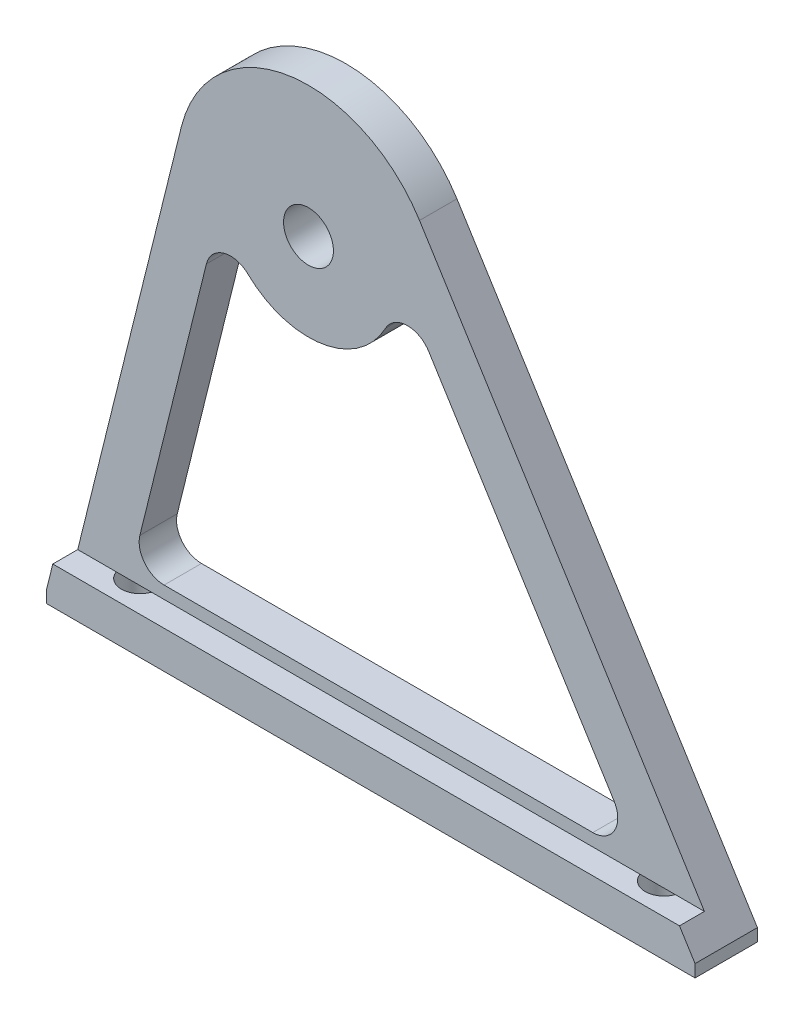
ISO-10303-21;
HEADER;
FILE_DESCRIPTION(('STEP AP214'),'2;1');
FILE_NAME('part.step','',(''),(''),'','','');
FILE_SCHEMA(('AUTOMOTIVE_DESIGN { 1 0 10303 214 1 1 1 1 }'));
ENDSEC;
DATA;
#1=APPLICATION_CONTEXT('core data for automotive mechanical design processes');
#2=APPLICATION_PROTOCOL_DEFINITION('international standard','automotive_design',2000,#1);
#3=PRODUCT_CONTEXT('',#1,'mechanical');
#4=PRODUCT('Part','Part','',(#3));
#5=PRODUCT_RELATED_PRODUCT_CATEGORY('part','',(#4));
#6=PRODUCT_DEFINITION_FORMATION('','',#4);
#7=PRODUCT_DEFINITION_CONTEXT('part definition',#1,'design');
#8=PRODUCT_DEFINITION('design','',#6,#7);
#9=PRODUCT_DEFINITION_SHAPE('','',#8);
#10=(LENGTH_UNIT() NAMED_UNIT(*) SI_UNIT(.MILLI.,.METRE.));
#11=(NAMED_UNIT(*) PLANE_ANGLE_UNIT() SI_UNIT($,.RADIAN.));
#12=(NAMED_UNIT(*) SI_UNIT($,.STERADIAN.) SOLID_ANGLE_UNIT());
#13=UNCERTAINTY_MEASURE_WITH_UNIT(LENGTH_MEASURE(1.E-05),#10,'distance_accuracy_value','');
#14=(GEOMETRIC_REPRESENTATION_CONTEXT(3) GLOBAL_UNCERTAINTY_ASSIGNED_CONTEXT((#13)) GLOBAL_UNIT_ASSIGNED_CONTEXT((#10,
#11,#12)) REPRESENTATION_CONTEXT('',''));
#15=CARTESIAN_POINT('',(0.,0.,0.));
#16=DIRECTION('',(0.,0.,1.));
#17=DIRECTION('',(1.,0.,0.));
#18=AXIS2_PLACEMENT_3D('',#15,#16,#17);
#19=CARTESIAN_POINT('',(0.,0.,5.));
#20=DIRECTION('',(0.,0.,-1.));
#21=DIRECTION('',(-1.,0.,0.));
#22=AXIS2_PLACEMENT_3D('',#19,#20,#21);
#23=CYLINDRICAL_SURFACE('',#22,10.5);
#24=CARTESIAN_POINT('',(0.,0.,3.));
#25=DIRECTION('',(0.,0.,1.));
#26=DIRECTION('',(1.,0.,0.));
#27=AXIS2_PLACEMENT_3D('',#24,#25,#26);
#28=CIRCLE('',#27,10.5);
#29=CARTESIAN_POINT('',(8.90471895944787,5.56380986853879,3.));
#30=VERTEX_POINT('',#29);
#31=CARTESIAN_POINT('',(-10.1914133471424,2.52687435138502,3.));
#32=VERTEX_POINT('',#31);
#33=EDGE_CURVE('E214',#30,#32,#28,.T.);
#34=ORIENTED_EDGE('',*,*,#33,.F.);
#35=DIRECTION('',(0.,0.,-1.));
#36=VECTOR('',#35,1.);
#37=CARTESIAN_POINT('',(8.90471895944788,5.56380986853878,5.));
#38=LINE('',#37,#36);
#39=CARTESIAN_POINT('',(8.90471895944788,5.56380986853878,0.));
#40=VERTEX_POINT('',#39);
#41=EDGE_CURVE('E277',#30,#40,#38,.T.);
#42=ORIENTED_EDGE('',*,*,#41,.T.);
#43=CARTESIAN_POINT('',(0.,0.,0.));
#44=DIRECTION('',(0.,0.,1.));
#45=DIRECTION('',(1.,0.,0.));
#46=AXIS2_PLACEMENT_3D('',#43,#44,#45);
#47=CIRCLE('',#46,10.5);
#48=CARTESIAN_POINT('',(-10.1914133471424,2.52687435138502,0.));
#49=VERTEX_POINT('',#48);
#50=EDGE_CURVE('E264',#40,#49,#47,.T.);
#51=ORIENTED_EDGE('',*,*,#50,.T.);
#52=DIRECTION('',(0.,0.,-1.));
#53=VECTOR('',#52,1.);
#54=CARTESIAN_POINT('',(-10.1914133471424,2.52687435138502,5.));
#55=LINE('',#54,#53);
#56=EDGE_CURVE('E41',#32,#49,#55,.T.);
#57=ORIENTED_EDGE('',*,*,#56,.F.);
#58=EDGE_LOOP('',(#34,#42,#51,#57));
#59=FACE_BOUND('',#58,.T.);
#60=ADVANCED_FACE('F34',(#59),#23,.T.);
#61=CARTESIAN_POINT('',(-8.45269707809848,-7.0818439433983,5.));
#62=DIRECTION('',(0.970610794965944,-0.240654700131907,0.));
#63=DIRECTION('',(0.240654700131907,0.970610794965944,0.));
#64=AXIS2_PLACEMENT_3D('',#61,#62,#63);
#65=PLANE('',#64);
#66=DIRECTION('',(0.,0.,-1.));
#67=VECTOR('',#66,1.);
#68=CARTESIAN_POINT('',(-8.18468792196786,-6.00090689979386,5.));
#69=LINE('',#68,#67);
#70=CARTESIAN_POINT('',(-8.18468792196786,-6.00090689979386,3.));
#71=VERTEX_POINT('',#70);
#72=CARTESIAN_POINT('',(-8.18468792196786,-6.00090689979386,0.));
#73=VERTEX_POINT('',#72);
#74=EDGE_CURVE('E248',#71,#73,#69,.T.);
#75=ORIENTED_EDGE('',*,*,#74,.F.);
#76=DIRECTION('',(-0.240654700131907,-0.970610794965944,0.));
#77=VECTOR('',#76,1.);
#78=CARTESIAN_POINT('',(-8.45269707809848,-7.0818439433983,3.));
#79=LINE('',#78,#77);
#80=CARTESIAN_POINT('',(-13.5198395714965,-27.5186905997362,3.));
#81=VERTEX_POINT('',#80);
#82=EDGE_CURVE('E209',#71,#81,#79,.T.);
#83=ORIENTED_EDGE('',*,*,#82,.T.);
#84=DIRECTION('',(0.,0.,-1.));
#85=VECTOR('',#84,1.);
#86=CARTESIAN_POINT('',(-13.5198395714965,-27.5186905997362,5.));
#87=LINE('',#86,#85);
#88=CARTESIAN_POINT('',(-13.5198395714965,-27.5186905997362,0.));
#89=VERTEX_POINT('',#88);
#90=EDGE_CURVE('E262',#81,#89,#87,.T.);
#91=ORIENTED_EDGE('',*,*,#90,.T.);
#92=DIRECTION('',(-0.240654700131907,-0.970610794965944,0.));
#93=VECTOR('',#92,1.);
#94=CARTESIAN_POINT('',(-8.45269707809848,-7.0818439433983,0.));
#95=LINE('',#94,#93);
#96=EDGE_CURVE('E224',#73,#89,#95,.T.);
#97=ORIENTED_EDGE('',*,*,#96,.F.);
#98=EDGE_LOOP('',(#75,#83,#91,#97));
#99=FACE_BOUND('',#98,.T.);
#100=ADVANCED_FACE('F346',(#99),#65,.T.);
#101=CARTESIAN_POINT('',(-11.5786179815646,-28.,5.));
#102=DIRECTION('',(0.,0.,-1.));
#103=DIRECTION('',(-1.,0.,0.));
#104=AXIS2_PLACEMENT_3D('',#101,#102,#103);
#105=CYLINDRICAL_SURFACE('',#104,2.);
#106=ORIENTED_EDGE('',*,*,#90,.F.);
#107=CARTESIAN_POINT('',(-11.5786179815646,-28.,3.));
#108=DIRECTION('',(0.,0.,1.));
#109=DIRECTION('',(1.,0.,0.));
#110=AXIS2_PLACEMENT_3D('',#107,#108,#109);
#111=CIRCLE('',#110,2.);
#112=CARTESIAN_POINT('',(-11.5786179815646,-30.,3.));
#113=VERTEX_POINT('',#112);
#114=EDGE_CURVE('E206',#81,#113,#111,.T.);
#115=ORIENTED_EDGE('',*,*,#114,.T.);
#116=DIRECTION('',(0.,0.,-1.));
#117=VECTOR('',#116,1.);
#118=CARTESIAN_POINT('',(-11.5786179815646,-30.,5.));
#119=LINE('',#118,#117);
#120=CARTESIAN_POINT('',(-11.5786179815646,-30.,0.));
#121=VERTEX_POINT('',#120);
#122=EDGE_CURVE('E260',#113,#121,#119,.T.);
#123=ORIENTED_EDGE('',*,*,#122,.T.);
#124=CARTESIAN_POINT('',(-11.5786179815646,-28.,0.));
#125=DIRECTION('',(0.,0.,1.));
#126=DIRECTION('',(-1.,0.,0.));
#127=AXIS2_PLACEMENT_3D('',#124,#125,#126);
#128=CIRCLE('',#127,2.);
#129=EDGE_CURVE('E227',#89,#121,#128,.T.);
#130=ORIENTED_EDGE('',*,*,#129,.F.);
#131=EDGE_LOOP('',(#106,#115,#123,#130));
#132=FACE_BOUND('',#131,.T.);
#133=ADVANCED_FACE('F344',(#132),#105,.F.);
#134=CARTESIAN_POINT('',(-11.5786179815646,-30.,5.));
#135=DIRECTION('',(0.,1.,0.));
#136=DIRECTION('',(0.,0.,1.));
#137=AXIS2_PLACEMENT_3D('',#134,#135,#136);
#138=PLANE('',#137);
#139=ORIENTED_EDGE('',*,*,#122,.F.);
#140=DIRECTION('',(1.,0.,0.));
#141=VECTOR('',#140,1.);
#142=CARTESIAN_POINT('',(-11.5786179815646,-30.,3.));
#143=LINE('',#142,#141);
#144=CARTESIAN_POINT('',(22.8010201381667,-30.,3.));
#145=VERTEX_POINT('',#144);
#146=EDGE_CURVE('E203',#113,#145,#143,.T.);
#147=ORIENTED_EDGE('',*,*,#146,.T.);
#148=DIRECTION('',(0.,0.,-1.));
#149=VECTOR('',#148,1.);
#150=CARTESIAN_POINT('',(22.8010201381667,-30.,5.));
#151=LINE('',#150,#149);
#152=CARTESIAN_POINT('',(22.8010201381667,-30.,0.));
#153=VERTEX_POINT('',#152);
#154=EDGE_CURVE('E258',#145,#153,#151,.T.);
#155=ORIENTED_EDGE('',*,*,#154,.T.);
#156=DIRECTION('',(1.,0.,0.));
#157=VECTOR('',#156,1.);
#158=CARTESIAN_POINT('',(-11.5786179815646,-30.,0.));
#159=LINE('',#158,#157);
#160=EDGE_CURVE('E230',#121,#153,#159,.T.);
#161=ORIENTED_EDGE('',*,*,#160,.F.);
#162=EDGE_LOOP('',(#139,#147,#155,#161));
#163=FACE_BOUND('',#162,.T.);
#164=ADVANCED_FACE('F339',(#163),#138,.T.);
#165=CARTESIAN_POINT('',(22.8010201381667,-28.,5.));
#166=DIRECTION('',(0.,0.,-1.));
#167=DIRECTION('',(-1.,0.,0.));
#168=AXIS2_PLACEMENT_3D('',#165,#166,#167);
#169=CYLINDRICAL_SURFACE('',#168,2.);
#170=ORIENTED_EDGE('',*,*,#154,.F.);
#171=CARTESIAN_POINT('',(22.8010201381667,-28.,3.));
#172=DIRECTION('',(0.,0.,1.));
#173=DIRECTION('',(1.,0.,0.));
#174=AXIS2_PLACEMENT_3D('',#171,#172,#173);
#175=CIRCLE('',#174,2.);
#176=CARTESIAN_POINT('',(24.4971570828234,-26.9402266917069,3.));
#177=VERTEX_POINT('',#176);
#178=EDGE_CURVE('E200',#145,#177,#175,.T.);
#179=ORIENTED_EDGE('',*,*,#178,.T.);
#180=DIRECTION('',(0.,0.,-1.));
#181=VECTOR('',#180,1.);
#182=CARTESIAN_POINT('',(24.4971570828234,-26.9402266917069,5.));
#183=LINE('',#182,#181);
#184=CARTESIAN_POINT('',(24.4971570828234,-26.9402266917069,0.));
#185=VERTEX_POINT('',#184);
#186=EDGE_CURVE('E256',#177,#185,#183,.T.);
#187=ORIENTED_EDGE('',*,*,#186,.T.);
#188=CARTESIAN_POINT('',(22.8010201381667,-28.,0.));
#189=DIRECTION('',(0.,0.,1.));
#190=DIRECTION('',(1.,0.,0.));
#191=AXIS2_PLACEMENT_3D('',#188,#189,#190);
#192=CIRCLE('',#191,2.);
#193=EDGE_CURVE('E233',#153,#185,#192,.T.);
#194=ORIENTED_EDGE('',*,*,#193,.F.);
#195=EDGE_LOOP('',(#170,#179,#187,#194));
#196=FACE_BOUND('',#195,.T.);
#197=ADVANCED_FACE('F336',(#196),#169,.F.);
#198=CARTESIAN_POINT('',(24.4971570828234,-26.9402266917069,5.));
#199=DIRECTION('',(-0.848068472328369,-0.529886654146551,0.));
#200=DIRECTION('',(0.529886654146551,-0.848068472328369,0.));
#201=AXIS2_PLACEMENT_3D('',#198,#199,#200);
#202=PLANE('',#201);
#203=ORIENTED_EDGE('',*,*,#186,.F.);
#204=DIRECTION('',(-0.529886654146551,0.848068472328369,0.));
#205=VECTOR('',#204,1.);
#206=CARTESIAN_POINT('',(24.4971570828234,-26.9402266917069,3.));
#207=LINE('',#206,#205);
#208=CARTESIAN_POINT('',(9.64250280268966,-3.16577631871268,3.));
#209=VERTEX_POINT('',#208);
#210=EDGE_CURVE('E197',#177,#209,#207,.T.);
#211=ORIENTED_EDGE('',*,*,#210,.T.);
#212=DIRECTION('',(0.,0.,-1.));
#213=VECTOR('',#212,1.);
#214=CARTESIAN_POINT('',(9.64250280268966,-3.16577631871268,5.));
#215=LINE('',#214,#213);
#216=CARTESIAN_POINT('',(9.64250280268966,-3.16577631871268,0.));
#217=VERTEX_POINT('',#216);
#218=EDGE_CURVE('E254',#209,#217,#215,.T.);
#219=ORIENTED_EDGE('',*,*,#218,.T.);
#220=DIRECTION('',(-0.529886654146551,0.848068472328369,0.));
#221=VECTOR('',#220,1.);
#222=CARTESIAN_POINT('',(24.4971570828234,-26.9402266917069,0.));
#223=LINE('',#222,#221);
#224=EDGE_CURVE('E236',#185,#217,#223,.T.);
#225=ORIENTED_EDGE('',*,*,#224,.F.);
#226=EDGE_LOOP('',(#203,#211,#219,#225));
#227=FACE_BOUND('',#226,.T.);
#228=ADVANCED_FACE('F332',(#227),#202,.T.);
#229=CARTESIAN_POINT('',(7.94636585803292,-4.22554962700578,5.));
#230=DIRECTION('',(0.,0.,-1.));
#231=DIRECTION('',(-1.,0.,0.));
#232=AXIS2_PLACEMENT_3D('',#229,#230,#231);
#233=CYLINDRICAL_SURFACE('',#232,2.);
#234=ORIENTED_EDGE('',*,*,#218,.F.);
#235=CARTESIAN_POINT('',(7.94636585803292,-4.22554962700578,3.));
#236=DIRECTION('',(0.,0.,1.));
#237=DIRECTION('',(1.,0.,0.));
#238=AXIS2_PLACEMENT_3D('',#235,#236,#237);
#239=CIRCLE('',#238,2.);
#240=CARTESIAN_POINT('',(6.18050677847005,-3.28653859878227,3.));
#241=VERTEX_POINT('',#240);
#242=EDGE_CURVE('E194',#209,#241,#239,.T.);
#243=ORIENTED_EDGE('',*,*,#242,.T.);
#244=DIRECTION('',(0.,0.,-1.));
#245=VECTOR('',#244,1.);
#246=CARTESIAN_POINT('',(6.18050677847005,-3.28653859878227,5.));
#247=LINE('',#246,#245);
#248=CARTESIAN_POINT('',(6.18050677847005,-3.28653859878227,0.));
#249=VERTEX_POINT('',#248);
#250=EDGE_CURVE('E252',#241,#249,#247,.T.);
#251=ORIENTED_EDGE('',*,*,#250,.T.);
#252=CARTESIAN_POINT('',(7.94636585803292,-4.22554962700578,0.));
#253=DIRECTION('',(0.,0.,1.));
#254=DIRECTION('',(1.,0.,0.));
#255=AXIS2_PLACEMENT_3D('',#252,#253,#254);
#256=CIRCLE('',#255,2.);
#257=EDGE_CURVE('E239',#217,#249,#256,.T.);
#258=ORIENTED_EDGE('',*,*,#257,.F.);
#259=EDGE_LOOP('',(#234,#243,#251,#258));
#260=FACE_BOUND('',#259,.T.);
#261=ADVANCED_FACE('F329',(#260),#233,.F.);
#262=CARTESIAN_POINT('',(0.,0.,5.));
#263=DIRECTION('',(0.,0.,-1.));
#264=DIRECTION('',(-1.,0.,0.));
#265=AXIS2_PLACEMENT_3D('',#262,#263,#264);
#266=CYLINDRICAL_SURFACE('',#265,7.);
#267=ORIENTED_EDGE('',*,*,#250,.F.);
#268=CARTESIAN_POINT('',(0.,0.,3.));
#269=DIRECTION('',(0.,0.,1.));
#270=DIRECTION('',(1.,0.,0.));
#271=AXIS2_PLACEMENT_3D('',#268,#269,#270);
#272=CIRCLE('',#271,7.);
#273=CARTESIAN_POINT('',(-4.85602936936131,-5.04172378893374,3.));
#274=VERTEX_POINT('',#273);
#275=EDGE_CURVE('E191',#241,#274,#272,.F.);
#276=ORIENTED_EDGE('',*,*,#275,.T.);
#277=DIRECTION('',(0.,0.,-1.));
#278=VECTOR('',#277,1.);
#279=CARTESIAN_POINT('',(-4.85602936936131,-5.04172378893374,5.));
#280=LINE('',#279,#278);
#281=CARTESIAN_POINT('',(-4.85602936936131,-5.04172378893374,0.));
#282=VERTEX_POINT('',#281);
#283=EDGE_CURVE('E250',#274,#282,#280,.T.);
#284=ORIENTED_EDGE('',*,*,#283,.T.);
#285=CARTESIAN_POINT('',(0.,0.,0.));
#286=DIRECTION('',(0.,0.,-1.));
#287=DIRECTION('',(1.,0.,0.));
#288=AXIS2_PLACEMENT_3D('',#285,#286,#287);
#289=CIRCLE('',#288,7.);
#290=EDGE_CURVE('E242',#249,#282,#289,.T.);
#291=ORIENTED_EDGE('',*,*,#290,.F.);
#292=EDGE_LOOP('',(#267,#276,#284,#291));
#293=FACE_BOUND('',#292,.T.);
#294=ADVANCED_FACE('F317',(#293),#266,.T.);
#295=CARTESIAN_POINT('',(-6.24346633203597,-6.48221630005767,5.));
#296=DIRECTION('',(0.,0.,-1.));
#297=DIRECTION('',(-1.,0.,0.));
#298=AXIS2_PLACEMENT_3D('',#295,#296,#297);
#299=CYLINDRICAL_SURFACE('',#298,2.);
#300=ORIENTED_EDGE('',*,*,#283,.F.);
#301=CARTESIAN_POINT('',(-6.24346633203597,-6.48221630005767,3.));
#302=DIRECTION('',(0.,0.,1.));
#303=DIRECTION('',(1.,0.,0.));
#304=AXIS2_PLACEMENT_3D('',#301,#302,#303);
#305=CIRCLE('',#304,2.);
#306=EDGE_CURVE('E188',#274,#71,#305,.T.);
#307=ORIENTED_EDGE('',*,*,#306,.T.);
#308=ORIENTED_EDGE('',*,*,#74,.T.);
#309=CARTESIAN_POINT('',(-6.24346633203597,-6.48221630005767,0.));
#310=DIRECTION('',(0.,0.,1.));
#311=DIRECTION('',(-1.,0.,0.));
#312=AXIS2_PLACEMENT_3D('',#309,#310,#311);
#313=CIRCLE('',#312,2.);
#314=EDGE_CURVE('E245',#282,#73,#313,.T.);
#315=ORIENTED_EDGE('',*,*,#314,.F.);
#316=EDGE_LOOP('',(#300,#307,#308,#315));
#317=FACE_BOUND('',#316,.T.);
#318=ADVANCED_FACE('F320',(#317),#299,.F.);
#319=CARTESIAN_POINT('',(0.,0.,5.));
#320=DIRECTION('',(0.,0.,-1.));
#321=DIRECTION('',(-1.,0.,0.));
#322=AXIS2_PLACEMENT_3D('',#319,#320,#321);
#323=CYLINDRICAL_SURFACE('',#322,2.);
#324=CARTESIAN_POINT('',(0.,0.,0.));
#325=DIRECTION('',(0.,0.,1.));
#326=DIRECTION('',(1.,0.,0.));
#327=AXIS2_PLACEMENT_3D('',#324,#325,#326);
#328=CIRCLE('',#327,2.);
#329=CARTESIAN_POINT('',(2.,0.,0.));
#330=VERTEX_POINT('',#329);
#331=EDGE_CURVE('E221',#330,#330,#328,.T.);
#332=ORIENTED_EDGE('',*,*,#331,.F.);
#333=EDGE_LOOP('',(#332));
#334=FACE_BOUND('',#333,.T.);
#335=CARTESIAN_POINT('',(0.,0.,3.));
#336=DIRECTION('',(0.,0.,1.));
#337=DIRECTION('',(1.,0.,0.));
#338=AXIS2_PLACEMENT_3D('',#335,#336,#337);
#339=CIRCLE('',#338,2.);
#340=CARTESIAN_POINT('',(2.,0.,3.));
#341=VERTEX_POINT('',#340);
#342=EDGE_CURVE('E184',#341,#341,#339,.T.);
#343=ORIENTED_EDGE('',*,*,#342,.T.);
#344=EDGE_LOOP('',(#343));
#345=FACE_BOUND('',#344,.T.);
#346=ADVANCED_FACE('F306',(#334,#345),#323,.F.);
#347=CARTESIAN_POINT('',(0.,0.,5.));
#348=DIRECTION('',(0.,0.,1.));
#349=DIRECTION('',(1.,0.,0.));
#350=AXIS2_PLACEMENT_3D('',#347,#348,#349);
#351=PLANE('',#350);
#352=DIRECTION('',(1.,0.,0.));
#353=VECTOR('',#352,1.);
#354=CARTESIAN_POINT('',(54.2961840779549,-31.,5.));
#355=LINE('',#354,#353);
#356=CARTESIAN_POINT('',(-18.5041169923515,-31.,5.));
#357=VERTEX_POINT('',#356);
#358=CARTESIAN_POINT('',(31.7503682274811,-31.,5.));
#359=VERTEX_POINT('',#358);
#360=EDGE_CURVE('E186',#357,#359,#355,.T.);
#361=ORIENTED_EDGE('',*,*,#360,.F.);
#362=DIRECTION('',(-0.240654700131907,-0.970610794965944,0.));
#363=VECTOR('',#362,1.);
#364=CARTESIAN_POINT('',(-10.1914133471424,2.52687435138502,5.));
#365=LINE('',#364,#363);
#366=CARTESIAN_POINT('',(-19.,-33.,5.));
#367=VERTEX_POINT('',#366);
#368=EDGE_CURVE('E265',#357,#367,#365,.T.);
#369=ORIENTED_EDGE('',*,*,#368,.T.);
#370=DIRECTION('',(0.,-1.,0.));
#371=VECTOR('',#370,1.);
#372=CARTESIAN_POINT('',(-19.,-33.,5.));
#373=LINE('',#372,#371);
#374=CARTESIAN_POINT('',(-19.,-34.,5.));
#375=VERTEX_POINT('',#374);
#376=EDGE_CURVE('E267',#367,#375,#373,.T.);
#377=ORIENTED_EDGE('',*,*,#376,.T.);
#378=DIRECTION('',(1.,0.,0.));
#379=VECTOR('',#378,1.);
#380=CARTESIAN_POINT('',(-19.,-34.,5.));
#381=LINE('',#380,#379);
#382=CARTESIAN_POINT('',(33.,-34.,5.));
#383=VERTEX_POINT('',#382);
#384=EDGE_CURVE('E270',#375,#383,#381,.T.);
#385=ORIENTED_EDGE('',*,*,#384,.T.);
#386=DIRECTION('',(0.,1.,0.));
#387=VECTOR('',#386,1.);
#388=CARTESIAN_POINT('',(33.,-34.,5.));
#389=LINE('',#388,#387);
#390=CARTESIAN_POINT('',(33.,-33.,5.));
#391=VERTEX_POINT('',#390);
#392=EDGE_CURVE('E272',#383,#391,#389,.T.);
#393=ORIENTED_EDGE('',*,*,#392,.T.);
#394=DIRECTION('',(-0.529886654146551,0.848068472328369,0.));
#395=VECTOR('',#394,1.);
#396=CARTESIAN_POINT('',(33.,-33.,5.));
#397=LINE('',#396,#395);
#398=EDGE_CURVE('E274',#391,#359,#397,.T.);
#399=ORIENTED_EDGE('',*,*,#398,.T.);
#400=EDGE_LOOP('',(#361,#369,#377,#385,#393,#399));
#401=FACE_BOUND('',#400,.T.);
#402=ADVANCED_FACE('F357',(#401),#351,.T.);
#403=CARTESIAN_POINT('',(0.,0.,0.));
#404=DIRECTION('',(0.,0.,1.));
#405=DIRECTION('',(1.,0.,0.));
#406=AXIS2_PLACEMENT_3D('',#403,#404,#405);
#407=PLANE('',#406);
#408=ORIENTED_EDGE('',*,*,#96,.T.);
#409=ORIENTED_EDGE('',*,*,#129,.T.);
#410=ORIENTED_EDGE('',*,*,#160,.T.);
#411=ORIENTED_EDGE('',*,*,#193,.T.);
#412=ORIENTED_EDGE('',*,*,#224,.T.);
#413=ORIENTED_EDGE('',*,*,#257,.T.);
#414=ORIENTED_EDGE('',*,*,#290,.T.);
#415=ORIENTED_EDGE('',*,*,#314,.T.);
#416=EDGE_LOOP('',(#408,#409,#410,#411,#412,#413,#414,#415));
#417=FACE_BOUND('',#416,.T.);
#418=ORIENTED_EDGE('',*,*,#50,.F.);
#419=DIRECTION('',(-0.529886654146551,0.848068472328369,0.));
#420=VECTOR('',#419,1.);
#421=CARTESIAN_POINT('',(33.,-33.,0.));
#422=LINE('',#421,#420);
#423=CARTESIAN_POINT('',(33.,-33.,0.));
#424=VERTEX_POINT('',#423);
#425=EDGE_CURVE('E268',#424,#40,#422,.T.);
#426=ORIENTED_EDGE('',*,*,#425,.F.);
#427=DIRECTION('',(0.,1.,0.));
#428=VECTOR('',#427,1.);
#429=CARTESIAN_POINT('',(33.,-34.,0.));
#430=LINE('',#429,#428);
#431=CARTESIAN_POINT('',(33.,-34.,0.));
#432=VERTEX_POINT('',#431);
#433=EDGE_CURVE('E286',#432,#424,#430,.T.);
#434=ORIENTED_EDGE('',*,*,#433,.F.);
#435=DIRECTION('',(1.,0.,0.));
#436=VECTOR('',#435,1.);
#437=CARTESIAN_POINT('',(-19.,-34.,0.));
#438=LINE('',#437,#436);
#439=CARTESIAN_POINT('',(-19.,-34.,0.));
#440=VERTEX_POINT('',#439);
#441=EDGE_CURVE('E284',#440,#432,#438,.T.);
#442=ORIENTED_EDGE('',*,*,#441,.F.);
#443=DIRECTION('',(0.,-1.,0.));
#444=VECTOR('',#443,1.);
#445=CARTESIAN_POINT('',(-19.,-33.,0.));
#446=LINE('',#445,#444);
#447=CARTESIAN_POINT('',(-19.,-33.,0.));
#448=VERTEX_POINT('',#447);
#449=EDGE_CURVE('E282',#448,#440,#446,.T.);
#450=ORIENTED_EDGE('',*,*,#449,.F.);
#451=DIRECTION('',(-0.240654700131907,-0.970610794965944,0.));
#452=VECTOR('',#451,1.);
#453=CARTESIAN_POINT('',(-10.1914133471424,2.52687435138502,0.));
#454=LINE('',#453,#452);
#455=EDGE_CURVE('E280',#49,#448,#454,.T.);
#456=ORIENTED_EDGE('',*,*,#455,.F.);
#457=EDGE_LOOP('',(#418,#426,#434,#442,#450,#456));
#458=FACE_BOUND('',#457,.T.);
#459=ORIENTED_EDGE('',*,*,#331,.T.);
#460=EDGE_LOOP('',(#459));
#461=FACE_BOUND('',#460,.T.);
#462=ADVANCED_FACE('F323',(#417,#458,#461),#407,.F.);
#463=CARTESIAN_POINT('',(-10.1914133471424,2.52687435138502,5.));
#464=DIRECTION('',(0.970610794965944,-0.240654700131907,0.));
#465=DIRECTION('',(0.240654700131907,0.970610794965944,0.));
#466=AXIS2_PLACEMENT_3D('',#463,#464,#465);
#467=PLANE('',#466);
#468=ORIENTED_EDGE('',*,*,#368,.F.);
#469=DIRECTION('',(0.,0.,-1.));
#470=VECTOR('',#469,1.);
#471=CARTESIAN_POINT('',(-18.5041169923515,-31.,5.));
#472=LINE('',#471,#470);
#473=CARTESIAN_POINT('',(-18.5041169923515,-31.,3.));
#474=VERTEX_POINT('',#473);
#475=EDGE_CURVE('E218',#357,#474,#472,.T.);
#476=ORIENTED_EDGE('',*,*,#475,.T.);
#477=DIRECTION('',(-0.240654700131907,-0.970610794965944,0.));
#478=VECTOR('',#477,1.);
#479=CARTESIAN_POINT('',(-10.1914133471424,2.52687435138502,3.));
#480=LINE('',#479,#478);
#481=EDGE_CURVE('E216',#32,#474,#480,.T.);
#482=ORIENTED_EDGE('',*,*,#481,.F.);
#483=ORIENTED_EDGE('',*,*,#56,.T.);
#484=ORIENTED_EDGE('',*,*,#455,.T.);
#485=DIRECTION('',(0.,0.,-1.));
#486=VECTOR('',#485,1.);
#487=CARTESIAN_POINT('',(-19.,-33.,5.));
#488=LINE('',#487,#486);
#489=EDGE_CURVE('E300',#367,#448,#488,.T.);
#490=ORIENTED_EDGE('',*,*,#489,.F.);
#491=EDGE_LOOP('',(#468,#476,#482,#483,#484,#490));
#492=FACE_BOUND('',#491,.T.);
#493=ADVANCED_FACE('F363',(#492),#467,.F.);
#494=CARTESIAN_POINT('',(-19.,-33.,5.));
#495=DIRECTION('',(1.,0.,0.));
#496=DIRECTION('',(0.,0.,-1.));
#497=AXIS2_PLACEMENT_3D('',#494,#495,#496);
#498=PLANE('',#497);
#499=ORIENTED_EDGE('',*,*,#449,.T.);
#500=DIRECTION('',(0.,0.,-1.));
#501=VECTOR('',#500,1.);
#502=CARTESIAN_POINT('',(-19.,-34.,5.));
#503=LINE('',#502,#501);
#504=EDGE_CURVE('E297',#375,#440,#503,.T.);
#505=ORIENTED_EDGE('',*,*,#504,.F.);
#506=ORIENTED_EDGE('',*,*,#376,.F.);
#507=ORIENTED_EDGE('',*,*,#489,.T.);
#508=EDGE_LOOP('',(#499,#505,#506,#507));
#509=FACE_BOUND('',#508,.T.);
#510=ADVANCED_FACE('F375',(#509),#498,.F.);
#511=CARTESIAN_POINT('',(-19.,-34.,5.));
#512=DIRECTION('',(0.,1.,0.));
#513=DIRECTION('',(0.,0.,1.));
#514=AXIS2_PLACEMENT_3D('',#511,#512,#513);
#515=PLANE('',#514);
#516=CARTESIAN_POINT('',(28.,-34.,2.50000000000001));
#517=DIRECTION('',(0.,-1.,0.));
#518=DIRECTION('',(0.,0.,-1.));
#519=AXIS2_PLACEMENT_3D('',#516,#517,#518);
#520=CIRCLE('',#519,1.5);
#521=CARTESIAN_POINT('',(28.,-34.,1.00000000000001));
#522=VERTEX_POINT('',#521);
#523=EDGE_CURVE('E170',#522,#522,#520,.T.);
#524=ORIENTED_EDGE('',*,*,#523,.F.);
#525=EDGE_LOOP('',(#524));
#526=FACE_BOUND('',#525,.T.);
#527=CARTESIAN_POINT('',(-14.,-34.,2.5));
#528=DIRECTION('',(0.,-1.,0.));
#529=DIRECTION('',(0.,0.,-1.));
#530=AXIS2_PLACEMENT_3D('',#527,#528,#529);
#531=CIRCLE('',#530,1.5);
#532=CARTESIAN_POINT('',(-14.,-34.,0.999999999999999));
#533=VERTEX_POINT('',#532);
#534=EDGE_CURVE('E177',#533,#533,#531,.T.);
#535=ORIENTED_EDGE('',*,*,#534,.F.);
#536=EDGE_LOOP('',(#535));
#537=FACE_BOUND('',#536,.T.);
#538=ORIENTED_EDGE('',*,*,#441,.T.);
#539=DIRECTION('',(0.,0.,-1.));
#540=VECTOR('',#539,1.);
#541=CARTESIAN_POINT('',(33.,-34.,5.));
#542=LINE('',#541,#540);
#543=EDGE_CURVE('E294',#383,#432,#542,.T.);
#544=ORIENTED_EDGE('',*,*,#543,.F.);
#545=ORIENTED_EDGE('',*,*,#384,.F.);
#546=ORIENTED_EDGE('',*,*,#504,.T.);
#547=EDGE_LOOP('',(#538,#544,#545,#546));
#548=FACE_BOUND('',#547,.T.);
#549=ADVANCED_FACE('F371',(#526,#537,#548),#515,.F.);
#550=CARTESIAN_POINT('',(33.,-34.,5.));
#551=DIRECTION('',(-1.,0.,0.));
#552=DIRECTION('',(0.,0.,1.));
#553=AXIS2_PLACEMENT_3D('',#550,#551,#552);
#554=PLANE('',#553);
#555=ORIENTED_EDGE('',*,*,#433,.T.);
#556=DIRECTION('',(0.,0.,-1.));
#557=VECTOR('',#556,1.);
#558=CARTESIAN_POINT('',(33.,-33.,5.));
#559=LINE('',#558,#557);
#560=EDGE_CURVE('E291',#391,#424,#559,.T.);
#561=ORIENTED_EDGE('',*,*,#560,.F.);
#562=ORIENTED_EDGE('',*,*,#392,.F.);
#563=ORIENTED_EDGE('',*,*,#543,.T.);
#564=EDGE_LOOP('',(#555,#561,#562,#563));
#565=FACE_BOUND('',#564,.T.);
#566=ADVANCED_FACE('F367',(#565),#554,.F.);
#567=CARTESIAN_POINT('',(33.,-33.,5.));
#568=DIRECTION('',(-0.848068472328369,-0.529886654146551,0.));
#569=DIRECTION('',(0.529886654146551,-0.848068472328369,0.));
#570=AXIS2_PLACEMENT_3D('',#567,#568,#569);
#571=PLANE('',#570);
#572=DIRECTION('',(-0.529886654146551,0.848068472328369,0.));
#573=VECTOR('',#572,1.);
#574=CARTESIAN_POINT('',(33.,-33.,3.));
#575=LINE('',#574,#573);
#576=CARTESIAN_POINT('',(31.7503682274811,-31.,3.));
#577=VERTEX_POINT('',#576);
#578=EDGE_CURVE('E212',#577,#30,#575,.T.);
#579=ORIENTED_EDGE('',*,*,#578,.F.);
#580=DIRECTION('',(0.,0.,1.));
#581=VECTOR('',#580,1.);
#582=CARTESIAN_POINT('',(31.7503682274811,-31.,5.));
#583=LINE('',#582,#581);
#584=EDGE_CURVE('E11',#577,#359,#583,.T.);
#585=ORIENTED_EDGE('',*,*,#584,.T.);
#586=ORIENTED_EDGE('',*,*,#398,.F.);
#587=ORIENTED_EDGE('',*,*,#560,.T.);
#588=ORIENTED_EDGE('',*,*,#425,.T.);
#589=ORIENTED_EDGE('',*,*,#41,.F.);
#590=EDGE_LOOP('',(#579,#585,#586,#587,#588,#589));
#591=FACE_BOUND('',#590,.T.);
#592=ADVANCED_FACE('F364',(#591),#571,.F.);
#593=CARTESIAN_POINT('',(54.2961840779549,-31.,3.));
#594=DIRECTION('',(0.,-1.,0.));
#595=DIRECTION('',(1.,0.,0.));
#596=AXIS2_PLACEMENT_3D('',#593,#594,#595);
#597=PLANE('',#596);
#598=DIRECTION('',(1.,0.,0.));
#599=VECTOR('',#598,1.);
#600=CARTESIAN_POINT('',(54.2961840779549,-31.,3.));
#601=LINE('',#600,#599);
#602=CARTESIAN_POINT('',(29.4142135623731,-31.,3.));
#603=VERTEX_POINT('',#602);
#604=EDGE_CURVE('E166',#603,#577,#601,.T.);
#605=ORIENTED_EDGE('',*,*,#604,.F.);
#606=CARTESIAN_POINT('',(28.,-31.,2.50000000000001));
#607=DIRECTION('',(0.,-1.,0.));
#608=DIRECTION('',(0.,0.,-1.));
#609=AXIS2_PLACEMENT_3D('',#606,#607,#608);
#610=CIRCLE('',#609,1.5);
#611=CARTESIAN_POINT('',(26.5857864376269,-31.,3.));
#612=VERTEX_POINT('',#611);
#613=EDGE_CURVE('E47',#603,#612,#610,.T.);
#614=ORIENTED_EDGE('',*,*,#613,.T.);
#615=CARTESIAN_POINT('',(-12.5857864376269,-31.,3.));
#616=VERTEX_POINT('',#615);
#617=EDGE_CURVE('E165',#616,#612,#601,.T.);
#618=ORIENTED_EDGE('',*,*,#617,.F.);
#619=CARTESIAN_POINT('',(-14.,-31.,2.5));
#620=DIRECTION('',(0.,-1.,0.));
#621=DIRECTION('',(0.,0.,-1.));
#622=AXIS2_PLACEMENT_3D('',#619,#620,#621);
#623=CIRCLE('',#622,1.5);
#624=CARTESIAN_POINT('',(-15.4142135623731,-31.,3.));
#625=VERTEX_POINT('',#624);
#626=EDGE_CURVE('E54',#616,#625,#623,.T.);
#627=ORIENTED_EDGE('',*,*,#626,.T.);
#628=EDGE_CURVE('E181',#474,#625,#601,.T.);
#629=ORIENTED_EDGE('',*,*,#628,.F.);
#630=ORIENTED_EDGE('',*,*,#475,.F.);
#631=ORIENTED_EDGE('',*,*,#360,.T.);
#632=ORIENTED_EDGE('',*,*,#584,.F.);
#633=EDGE_LOOP('',(#605,#614,#618,#627,#629,#630,#631,#632));
#634=FACE_BOUND('',#633,.T.);
#635=ADVANCED_FACE('F174',(#634),#597,.F.);
#636=CARTESIAN_POINT('',(0.,0.,3.));
#637=DIRECTION('',(0.,0.,1.));
#638=DIRECTION('',(1.,0.,0.));
#639=AXIS2_PLACEMENT_3D('',#636,#637,#638);
#640=PLANE('',#639);
#641=ORIENTED_EDGE('',*,*,#342,.F.);
#642=EDGE_LOOP('',(#641));
#643=FACE_BOUND('',#642,.T.);
#644=ORIENTED_EDGE('',*,*,#306,.F.);
#645=ORIENTED_EDGE('',*,*,#275,.F.);
#646=ORIENTED_EDGE('',*,*,#242,.F.);
#647=ORIENTED_EDGE('',*,*,#210,.F.);
#648=ORIENTED_EDGE('',*,*,#178,.F.);
#649=ORIENTED_EDGE('',*,*,#146,.F.);
#650=ORIENTED_EDGE('',*,*,#114,.F.);
#651=ORIENTED_EDGE('',*,*,#82,.F.);
#652=EDGE_LOOP('',(#644,#645,#646,#647,#648,#649,#650,#651));
#653=FACE_BOUND('',#652,.T.);
#654=ORIENTED_EDGE('',*,*,#481,.T.);
#655=ORIENTED_EDGE('',*,*,#628,.T.);
#656=EDGE_CURVE('E180',#625,#616,#601,.T.);
#657=ORIENTED_EDGE('',*,*,#656,.T.);
#658=ORIENTED_EDGE('',*,*,#617,.T.);
#659=EDGE_CURVE('E159',#612,#603,#601,.T.);
#660=ORIENTED_EDGE('',*,*,#659,.T.);
#661=ORIENTED_EDGE('',*,*,#604,.T.);
#662=ORIENTED_EDGE('',*,*,#578,.T.);
#663=ORIENTED_EDGE('',*,*,#33,.T.);
#664=EDGE_LOOP('',(#654,#655,#657,#658,#660,#661,#662,#663));
#665=FACE_BOUND('',#664,.T.);
#666=ADVANCED_FACE('F178',(#643,#653,#665),#640,.T.);
#667=CARTESIAN_POINT('',(-14.,-31.,2.5));
#668=DIRECTION('',(0.,-1.,0.));
#669=DIRECTION('',(0.,0.,-1.));
#670=AXIS2_PLACEMENT_3D('',#667,#668,#669);
#671=CYLINDRICAL_SURFACE('',#670,1.5);
#672=ORIENTED_EDGE('',*,*,#626,.F.);
#673=EDGE_CURVE('E530',#625,#616,#623,.T.);
#674=ORIENTED_EDGE('',*,*,#673,.F.);
#675=EDGE_LOOP('',(#672,#674));
#676=FACE_BOUND('',#675,.T.);
#677=ORIENTED_EDGE('',*,*,#534,.T.);
#678=EDGE_LOOP('',(#677));
#679=FACE_BOUND('',#678,.T.);
#680=ADVANCED_FACE('F310',(#676,#679),#671,.F.);
#681=CARTESIAN_POINT('',(-14.,-31.,2.5));
#682=DIRECTION('',(0.,-1.,0.));
#683=DIRECTION('',(0.,0.,-1.));
#684=AXIS2_PLACEMENT_3D('',#681,#682,#683);
#685=PLANE('',#684);
#686=ORIENTED_EDGE('',*,*,#673,.T.);
#687=ORIENTED_EDGE('',*,*,#656,.F.);
#688=EDGE_LOOP('',(#686,#687));
#689=FACE_BOUND('',#688,.T.);
#690=ADVANCED_FACE('F501',(#689),#685,.T.);
#691=CARTESIAN_POINT('',(28.,-31.,2.50000000000001));
#692=DIRECTION('',(0.,-1.,0.));
#693=DIRECTION('',(0.,0.,-1.));
#694=AXIS2_PLACEMENT_3D('',#691,#692,#693);
#695=CYLINDRICAL_SURFACE('',#694,1.5);
#696=ORIENTED_EDGE('',*,*,#613,.F.);
#697=EDGE_CURVE('E161',#612,#603,#610,.T.);
#698=ORIENTED_EDGE('',*,*,#697,.F.);
#699=EDGE_LOOP('',(#696,#698));
#700=FACE_BOUND('',#699,.T.);
#701=ORIENTED_EDGE('',*,*,#523,.T.);
#702=EDGE_LOOP('',(#701));
#703=FACE_BOUND('',#702,.T.);
#704=ADVANCED_FACE('F168',(#700,#703),#695,.F.);
#705=CARTESIAN_POINT('',(28.,-31.,2.50000000000001));
#706=DIRECTION('',(0.,-1.,0.));
#707=DIRECTION('',(0.,0.,-1.));
#708=AXIS2_PLACEMENT_3D('',#705,#706,#707);
#709=PLANE('',#708);
#710=ORIENTED_EDGE('',*,*,#697,.T.);
#711=ORIENTED_EDGE('',*,*,#659,.F.);
#712=EDGE_LOOP('',(#710,#711));
#713=FACE_BOUND('',#712,.T.);
#714=ADVANCED_FACE('F160',(#713),#709,.T.);
#715=CLOSED_SHELL('',(#60,#100,#133,#164,#197,#228,#261,#294,#318,#346,#402,#462,#493,#510,#549,
#566,#592,#635,#666,#680,#690,#704,#714));
#716=MANIFOLD_SOLID_BREP('B2',#715);
#717=ADVANCED_BREP_SHAPE_REPRESENTATION('',(#18,#716),#14);
#718=SHAPE_DEFINITION_REPRESENTATION(#9,#717);
ENDSEC;
END-ISO-10303-21;
